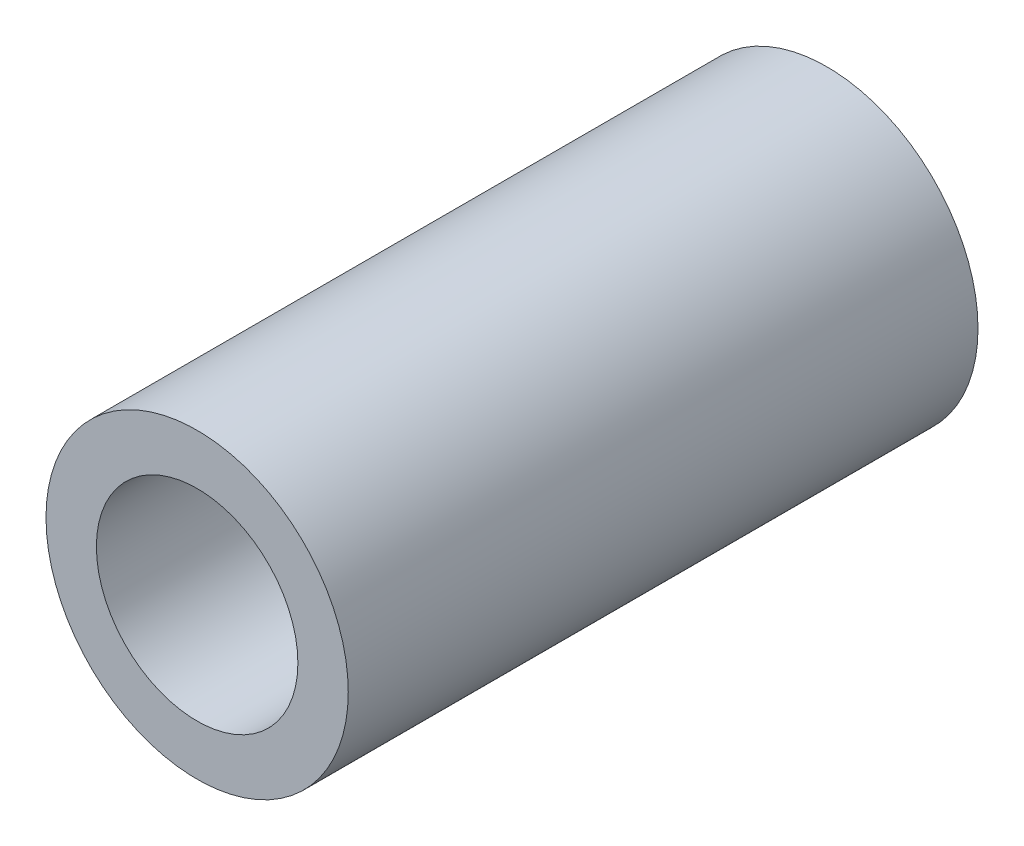
ISO-10303-21;
HEADER;
FILE_DESCRIPTION(('STEP AP214'),'2;1');
FILE_NAME('part.step','',(''),(''),'','','');
FILE_SCHEMA(('AUTOMOTIVE_DESIGN { 1 0 10303 214 1 1 1 1 }'));
ENDSEC;
DATA;
#1=APPLICATION_CONTEXT('core data for automotive mechanical design processes');
#2=APPLICATION_PROTOCOL_DEFINITION('international standard','automotive_design',2000,#1);
#3=PRODUCT_CONTEXT('',#1,'mechanical');
#4=PRODUCT('Part','Part','',(#3));
#5=PRODUCT_RELATED_PRODUCT_CATEGORY('part','',(#4));
#6=PRODUCT_DEFINITION_FORMATION('','',#4);
#7=PRODUCT_DEFINITION_CONTEXT('part definition',#1,'design');
#8=PRODUCT_DEFINITION('design','',#6,#7);
#9=PRODUCT_DEFINITION_SHAPE('','',#8);
#10=(LENGTH_UNIT() NAMED_UNIT(*) SI_UNIT(.MILLI.,.METRE.));
#11=(NAMED_UNIT(*) PLANE_ANGLE_UNIT() SI_UNIT($,.RADIAN.));
#12=(NAMED_UNIT(*) SI_UNIT($,.STERADIAN.) SOLID_ANGLE_UNIT());
#13=UNCERTAINTY_MEASURE_WITH_UNIT(LENGTH_MEASURE(1.E-05),#10,'distance_accuracy_value','');
#14=(GEOMETRIC_REPRESENTATION_CONTEXT(3) GLOBAL_UNCERTAINTY_ASSIGNED_CONTEXT((#13)) GLOBAL_UNIT_ASSIGNED_CONTEXT((#10,
#11,#12)) REPRESENTATION_CONTEXT('',''));
#15=CARTESIAN_POINT('',(0.,0.,0.));
#16=DIRECTION('',(0.,0.,1.));
#17=DIRECTION('',(1.,0.,0.));
#18=AXIS2_PLACEMENT_3D('',#15,#16,#17);
#19=CARTESIAN_POINT('',(0.,0.,10.));
#20=DIRECTION('',(0.,0.,1.));
#21=DIRECTION('',(1.,0.,0.));
#22=AXIS2_PLACEMENT_3D('',#19,#20,#21);
#23=PLANE('',#22);
#24=CARTESIAN_POINT('',(0.,0.,10.));
#25=DIRECTION('',(0.,0.,1.));
#26=DIRECTION('',(1.,0.,0.));
#27=AXIS2_PLACEMENT_3D('',#24,#25,#26);
#28=CIRCLE('',#27,2.4);
#29=CARTESIAN_POINT('',(2.4,0.,10.));
#30=VERTEX_POINT('',#29);
#31=EDGE_CURVE('E10',#30,#30,#28,.T.);
#32=ORIENTED_EDGE('',*,*,#31,.T.);
#33=EDGE_LOOP('',(#32));
#34=FACE_BOUND('',#33,.T.);
#35=CARTESIAN_POINT('',(0.,0.,10.));
#36=DIRECTION('',(0.,0.,1.));
#37=DIRECTION('',(1.,0.,0.));
#38=AXIS2_PLACEMENT_3D('',#35,#36,#37);
#39=CIRCLE('',#38,1.6);
#40=CARTESIAN_POINT('',(1.6,0.,10.));
#41=VERTEX_POINT('',#40);
#42=EDGE_CURVE('E44',#41,#41,#39,.T.);
#43=ORIENTED_EDGE('',*,*,#42,.F.);
#44=EDGE_LOOP('',(#43));
#45=FACE_BOUND('',#44,.T.);
#46=ADVANCED_FACE('F33',(#34,#45),#23,.T.);
#47=CARTESIAN_POINT('',(0.,0.,0.));
#48=DIRECTION('',(0.,0.,1.));
#49=DIRECTION('',(1.,0.,0.));
#50=AXIS2_PLACEMENT_3D('',#47,#48,#49);
#51=PLANE('',#50);
#52=CARTESIAN_POINT('',(0.,0.,0.));
#53=DIRECTION('',(0.,0.,1.));
#54=DIRECTION('',(1.,0.,0.));
#55=AXIS2_PLACEMENT_3D('',#52,#53,#54);
#56=CIRCLE('',#55,2.4);
#57=CARTESIAN_POINT('',(2.4,0.,0.));
#58=VERTEX_POINT('',#57);
#59=EDGE_CURVE('E37',#58,#58,#56,.T.);
#60=ORIENTED_EDGE('',*,*,#59,.F.);
#61=EDGE_LOOP('',(#60));
#62=FACE_BOUND('',#61,.T.);
#63=CARTESIAN_POINT('',(0.,0.,0.));
#64=DIRECTION('',(0.,0.,1.));
#65=DIRECTION('',(1.,0.,0.));
#66=AXIS2_PLACEMENT_3D('',#63,#64,#65);
#67=CIRCLE('',#66,1.6);
#68=CARTESIAN_POINT('',(1.6,0.,0.));
#69=VERTEX_POINT('',#68);
#70=EDGE_CURVE('E46',#69,#69,#67,.T.);
#71=ORIENTED_EDGE('',*,*,#70,.T.);
#72=EDGE_LOOP('',(#71));
#73=FACE_BOUND('',#72,.T.);
#74=ADVANCED_FACE('F56',(#62,#73),#51,.F.);
#75=CARTESIAN_POINT('',(0.,0.,10.));
#76=DIRECTION('',(0.,0.,-1.));
#77=DIRECTION('',(-1.,0.,0.));
#78=AXIS2_PLACEMENT_3D('',#75,#76,#77);
#79=CYLINDRICAL_SURFACE('',#78,2.4);
#80=ORIENTED_EDGE('',*,*,#31,.F.);
#81=EDGE_LOOP('',(#80));
#82=FACE_BOUND('',#81,.T.);
#83=ORIENTED_EDGE('',*,*,#59,.T.);
#84=EDGE_LOOP('',(#83));
#85=FACE_BOUND('',#84,.T.);
#86=ADVANCED_FACE('F35',(#82,#85),#79,.T.);
#87=CARTESIAN_POINT('',(0.,0.,10.));
#88=DIRECTION('',(0.,0.,-1.));
#89=DIRECTION('',(-1.,0.,0.));
#90=AXIS2_PLACEMENT_3D('',#87,#88,#89);
#91=CYLINDRICAL_SURFACE('',#90,1.6);
#92=ORIENTED_EDGE('',*,*,#42,.T.);
#93=EDGE_LOOP('',(#92));
#94=FACE_BOUND('',#93,.T.);
#95=ORIENTED_EDGE('',*,*,#70,.F.);
#96=EDGE_LOOP('',(#95));
#97=FACE_BOUND('',#96,.T.);
#98=ADVANCED_FACE('F52',(#94,#97),#91,.F.);
#99=CLOSED_SHELL('',(#46,#74,#86,#98));
#100=MANIFOLD_SOLID_BREP('B2',#99);
#101=ADVANCED_BREP_SHAPE_REPRESENTATION('',(#18,#100),#14);
#102=SHAPE_DEFINITION_REPRESENTATION(#9,#101);
ENDSEC;
END-ISO-10303-21;
